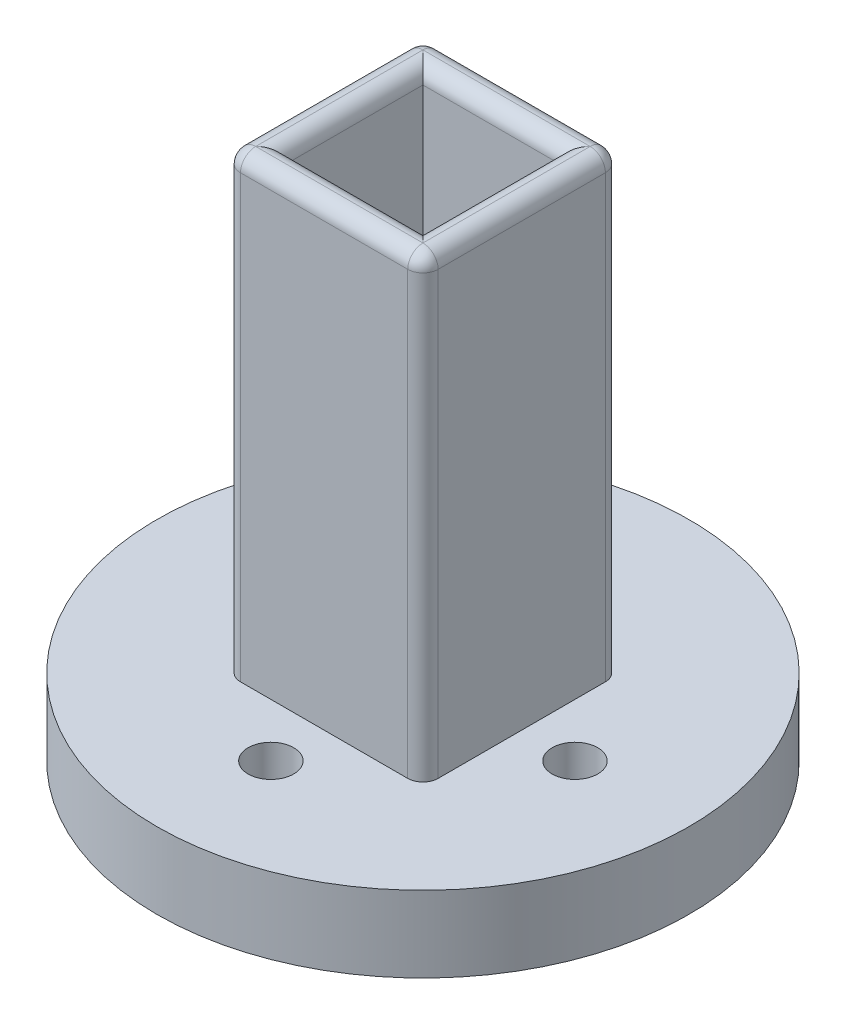
ISO-10303-21;
HEADER;
FILE_DESCRIPTION(('STEP AP214'),'2;1');
FILE_NAME('part.step','',(''),(''),'','','');
FILE_SCHEMA(('AUTOMOTIVE_DESIGN { 1 0 10303 214 1 1 1 1 }'));
ENDSEC;
DATA;
#1=APPLICATION_CONTEXT('core data for automotive mechanical design processes');
#2=APPLICATION_PROTOCOL_DEFINITION('international standard','automotive_design',2000,#1);
#3=PRODUCT_CONTEXT('',#1,'mechanical');
#4=PRODUCT('Part','Part','',(#3));
#5=PRODUCT_RELATED_PRODUCT_CATEGORY('part','',(#4));
#6=PRODUCT_DEFINITION_FORMATION('','',#4);
#7=PRODUCT_DEFINITION_CONTEXT('part definition',#1,'design');
#8=PRODUCT_DEFINITION('design','',#6,#7);
#9=PRODUCT_DEFINITION_SHAPE('','',#8);
#10=(LENGTH_UNIT() NAMED_UNIT(*) SI_UNIT(.MILLI.,.METRE.));
#11=(NAMED_UNIT(*) PLANE_ANGLE_UNIT() SI_UNIT($,.RADIAN.));
#12=(NAMED_UNIT(*) SI_UNIT($,.STERADIAN.) SOLID_ANGLE_UNIT());
#13=UNCERTAINTY_MEASURE_WITH_UNIT(LENGTH_MEASURE(1.E-05),#10,'distance_accuracy_value','');
#14=(GEOMETRIC_REPRESENTATION_CONTEXT(3) GLOBAL_UNCERTAINTY_ASSIGNED_CONTEXT((#13)) GLOBAL_UNIT_ASSIGNED_CONTEXT((#10,
#11,#12)) REPRESENTATION_CONTEXT('',''));
#15=CARTESIAN_POINT('',(0.,0.,0.));
#16=DIRECTION('',(0.,0.,1.));
#17=DIRECTION('',(1.,0.,0.));
#18=AXIS2_PLACEMENT_3D('',#15,#16,#17);
#19=CARTESIAN_POINT('',(0.,5.,0.));
#20=DIRECTION('',(0.,1.,0.));
#21=DIRECTION('',(0.,0.,1.));
#22=AXIS2_PLACEMENT_3D('',#19,#20,#21);
#23=PLANE('',#22);
#24=CARTESIAN_POINT('',(0.,5.,10.));
#25=DIRECTION('',(0.,1.,0.));
#26=DIRECTION('',(0.,0.,1.));
#27=AXIS2_PLACEMENT_3D('',#24,#25,#26);
#28=CIRCLE('',#27,1.5);
#29=CARTESIAN_POINT('',(0.,5.,11.5));
#30=VERTEX_POINT('',#29);
#31=EDGE_CURVE('E262',#30,#30,#28,.T.);
#32=ORIENTED_EDGE('',*,*,#31,.F.);
#33=EDGE_LOOP('',(#32));
#34=FACE_BOUND('',#33,.T.);
#35=CARTESIAN_POINT('',(0.,5.,-10.));
#36=DIRECTION('',(0.,1.,0.));
#37=DIRECTION('',(0.,0.,1.));
#38=AXIS2_PLACEMENT_3D('',#35,#36,#37);
#39=CIRCLE('',#38,1.5);
#40=CARTESIAN_POINT('',(0.,5.,-8.5));
#41=VERTEX_POINT('',#40);
#42=EDGE_CURVE('E274',#41,#41,#39,.T.);
#43=ORIENTED_EDGE('',*,*,#42,.F.);
#44=EDGE_LOOP('',(#43));
#45=FACE_BOUND('',#44,.T.);
#46=CARTESIAN_POINT('',(0.,5.,0.));
#47=DIRECTION('',(0.,1.,0.));
#48=DIRECTION('',(0.,0.,1.));
#49=AXIS2_PLACEMENT_3D('',#46,#47,#48);
#50=CIRCLE('',#49,17.5);
#51=CARTESIAN_POINT('',(0.,5.,17.5));
#52=VERTEX_POINT('',#51);
#53=EDGE_CURVE('E286',#52,#52,#50,.T.);
#54=ORIENTED_EDGE('',*,*,#53,.T.);
#55=EDGE_LOOP('',(#54));
#56=FACE_BOUND('',#55,.T.);
#57=CARTESIAN_POINT('',(10.,5.,0.));
#58=DIRECTION('',(0.,1.,0.));
#59=DIRECTION('',(0.,0.,1.));
#60=AXIS2_PLACEMENT_3D('',#57,#58,#59);
#61=CIRCLE('',#60,1.5);
#62=CARTESIAN_POINT('',(10.,5.,1.5));
#63=VERTEX_POINT('',#62);
#64=EDGE_CURVE('E268',#63,#63,#61,.T.);
#65=ORIENTED_EDGE('',*,*,#64,.F.);
#66=EDGE_LOOP('',(#65));
#67=FACE_BOUND('',#66,.T.);
#68=CARTESIAN_POINT('',(-10.,5.,0.));
#69=DIRECTION('',(0.,1.,0.));
#70=DIRECTION('',(0.,0.,1.));
#71=AXIS2_PLACEMENT_3D('',#68,#69,#70);
#72=CIRCLE('',#71,1.5);
#73=CARTESIAN_POINT('',(-10.,5.,1.5));
#74=VERTEX_POINT('',#73);
#75=EDGE_CURVE('E256',#74,#74,#72,.T.);
#76=ORIENTED_EDGE('',*,*,#75,.F.);
#77=EDGE_LOOP('',(#76));
#78=FACE_BOUND('',#77,.T.);
#79=DIRECTION('',(0.,0.,1.));
#80=VECTOR('',#79,1.);
#81=CARTESIAN_POINT('',(-6.5,5.,-6.5));
#82=LINE('',#81,#80);
#83=CARTESIAN_POINT('',(-6.5,5.,-5.5));
#84=VERTEX_POINT('',#83);
#85=CARTESIAN_POINT('',(-6.5,5.,5.5));
#86=VERTEX_POINT('',#85);
#87=EDGE_CURVE('E158',#84,#86,#82,.T.);
#88=ORIENTED_EDGE('',*,*,#87,.F.);
#89=CARTESIAN_POINT('',(-5.5,5.,-5.5));
#90=DIRECTION('',(0.,1.,0.));
#91=DIRECTION('',(0.,0.,1.));
#92=AXIS2_PLACEMENT_3D('',#89,#90,#91);
#93=CIRCLE('',#92,1.);
#94=CARTESIAN_POINT('',(-5.5,5.,-6.5));
#95=VERTEX_POINT('',#94);
#96=EDGE_CURVE('E154',#84,#95,#93,.F.);
#97=ORIENTED_EDGE('',*,*,#96,.T.);
#98=DIRECTION('',(-1.,0.,0.));
#99=VECTOR('',#98,1.);
#100=CARTESIAN_POINT('',(6.5,5.,-6.49999999999995));
#101=LINE('',#100,#99);
#102=CARTESIAN_POINT('',(5.5,5.,-6.49999999999996));
#103=VERTEX_POINT('',#102);
#104=EDGE_CURVE('E155',#103,#95,#101,.T.);
#105=ORIENTED_EDGE('',*,*,#104,.F.);
#106=CARTESIAN_POINT('',(5.5,5.,-5.49999999999996));
#107=DIRECTION('',(0.,1.,0.));
#108=DIRECTION('',(0.,0.,1.));
#109=AXIS2_PLACEMENT_3D('',#106,#107,#108);
#110=CIRCLE('',#109,1.);
#111=CARTESIAN_POINT('',(6.5,5.,-5.49999999999996));
#112=VERTEX_POINT('',#111);
#113=EDGE_CURVE('E161',#103,#112,#110,.F.);
#114=ORIENTED_EDGE('',*,*,#113,.T.);
#115=DIRECTION('',(0.,0.,-1.));
#116=VECTOR('',#115,1.);
#117=CARTESIAN_POINT('',(6.5,5.,6.5));
#118=LINE('',#117,#116);
#119=CARTESIAN_POINT('',(6.5,5.,5.5));
#120=VERTEX_POINT('',#119);
#121=EDGE_CURVE('E252',#120,#112,#118,.T.);
#122=ORIENTED_EDGE('',*,*,#121,.F.);
#123=CARTESIAN_POINT('',(5.5,5.,5.5));
#124=DIRECTION('',(0.,1.,0.));
#125=DIRECTION('',(0.,0.,1.));
#126=AXIS2_PLACEMENT_3D('',#123,#124,#125);
#127=CIRCLE('',#126,1.);
#128=CARTESIAN_POINT('',(5.5,5.,6.5));
#129=VERTEX_POINT('',#128);
#130=EDGE_CURVE('E48',#120,#129,#127,.F.);
#131=ORIENTED_EDGE('',*,*,#130,.T.);
#132=DIRECTION('',(1.,0.,0.));
#133=VECTOR('',#132,1.);
#134=CARTESIAN_POINT('',(-6.5,5.,6.5));
#135=LINE('',#134,#133);
#136=CARTESIAN_POINT('',(-5.5,5.,6.5));
#137=VERTEX_POINT('',#136);
#138=EDGE_CURVE('E249',#137,#129,#135,.T.);
#139=ORIENTED_EDGE('',*,*,#138,.F.);
#140=CARTESIAN_POINT('',(-5.5,5.,5.5));
#141=DIRECTION('',(0.,1.,0.));
#142=DIRECTION('',(0.,0.,1.));
#143=AXIS2_PLACEMENT_3D('',#140,#141,#142);
#144=CIRCLE('',#143,1.);
#145=EDGE_CURVE('E11',#137,#86,#144,.F.);
#146=ORIENTED_EDGE('',*,*,#145,.T.);
#147=EDGE_LOOP('',(#88,#97,#105,#114,#122,#131,#139,#146));
#148=FACE_BOUND('',#147,.T.);
#149=ADVANCED_FACE('F38',(#34,#45,#56,#67,#78,#148),#23,.T.);
#150=DIRECTION('',(0.,0.,1.));
#151=VECTOR('',#150,1.);
#152=CARTESIAN_POINT('',(-4.49999999999959,5.,4.49999999999997));
#153=LINE('',#152,#151);
#154=CARTESIAN_POINT('',(-4.49999999999962,5.,-4.50000000000003));
#155=VERTEX_POINT('',#154);
#156=CARTESIAN_POINT('',(-4.49999999999959,5.,4.49999999999997));
#157=VERTEX_POINT('',#156);
#158=EDGE_CURVE('E225',#155,#157,#153,.T.);
#159=ORIENTED_EDGE('',*,*,#158,.T.);
#160=DIRECTION('',(1.,0.,0.));
#161=VECTOR('',#160,1.);
#162=CARTESIAN_POINT('',(4.50000000000038,5.,4.49999999999996));
#163=LINE('',#162,#161);
#164=CARTESIAN_POINT('',(4.50000000000038,5.,4.49999999999996));
#165=VERTEX_POINT('',#164);
#166=EDGE_CURVE('E229',#157,#165,#163,.T.);
#167=ORIENTED_EDGE('',*,*,#166,.T.);
#168=DIRECTION('',(0.,0.,-1.));
#169=VECTOR('',#168,1.);
#170=CARTESIAN_POINT('',(4.50000000000038,5.,-4.50000000000003));
#171=LINE('',#170,#169);
#172=CARTESIAN_POINT('',(4.50000000000038,5.,-4.50000000000003));
#173=VERTEX_POINT('',#172);
#174=EDGE_CURVE('E236',#165,#173,#171,.T.);
#175=ORIENTED_EDGE('',*,*,#174,.T.);
#176=DIRECTION('',(-1.,0.,0.));
#177=VECTOR('',#176,1.);
#178=CARTESIAN_POINT('',(-4.49999999999962,5.,-4.50000000000003));
#179=LINE('',#178,#177);
#180=EDGE_CURVE('E240',#173,#155,#179,.T.);
#181=ORIENTED_EDGE('',*,*,#180,.T.);
#182=EDGE_LOOP('',(#159,#167,#175,#181));
#183=FACE_BOUND('',#182,.T.);
#184=CARTESIAN_POINT('',(0.,5.,0.));
#185=DIRECTION('',(0.,1.,0.));
#186=DIRECTION('',(0.,0.,1.));
#187=AXIS2_PLACEMENT_3D('',#184,#185,#186);
#188=CIRCLE('',#187,4.05);
#189=CARTESIAN_POINT('',(0.,5.,4.05));
#190=VERTEX_POINT('',#189);
#191=EDGE_CURVE('E280',#190,#190,#188,.T.);
#192=ORIENTED_EDGE('',*,*,#191,.F.);
#193=EDGE_LOOP('',(#192));
#194=FACE_BOUND('',#193,.T.);
#195=ADVANCED_FACE('F378',(#183,#194),#23,.T.);
#196=CARTESIAN_POINT('',(0.,0.,0.));
#197=DIRECTION('',(0.,1.,0.));
#198=DIRECTION('',(0.,0.,1.));
#199=AXIS2_PLACEMENT_3D('',#196,#197,#198);
#200=PLANE('',#199);
#201=CARTESIAN_POINT('',(0.,0.,0.));
#202=DIRECTION('',(0.,1.,0.));
#203=DIRECTION('',(0.,0.,1.));
#204=AXIS2_PLACEMENT_3D('',#201,#202,#203);
#205=CIRCLE('',#204,17.5);
#206=CARTESIAN_POINT('',(0.,0.,17.5));
#207=VERTEX_POINT('',#206);
#208=EDGE_CURVE('E283',#207,#207,#205,.T.);
#209=ORIENTED_EDGE('',*,*,#208,.F.);
#210=EDGE_LOOP('',(#209));
#211=FACE_BOUND('',#210,.T.);
#212=CARTESIAN_POINT('',(0.,0.,0.));
#213=DIRECTION('',(0.,1.,0.));
#214=DIRECTION('',(0.,0.,1.));
#215=AXIS2_PLACEMENT_3D('',#212,#213,#214);
#216=CIRCLE('',#215,4.05);
#217=CARTESIAN_POINT('',(0.,0.,4.05));
#218=VERTEX_POINT('',#217);
#219=EDGE_CURVE('E277',#218,#218,#216,.T.);
#220=ORIENTED_EDGE('',*,*,#219,.T.);
#221=EDGE_LOOP('',(#220));
#222=FACE_BOUND('',#221,.T.);
#223=CARTESIAN_POINT('',(0.,0.,-10.));
#224=DIRECTION('',(0.,1.,0.));
#225=DIRECTION('',(0.,0.,1.));
#226=AXIS2_PLACEMENT_3D('',#223,#224,#225);
#227=CIRCLE('',#226,1.5);
#228=CARTESIAN_POINT('',(0.,0.,-8.5));
#229=VERTEX_POINT('',#228);
#230=EDGE_CURVE('E271',#229,#229,#227,.T.);
#231=ORIENTED_EDGE('',*,*,#230,.T.);
#232=EDGE_LOOP('',(#231));
#233=FACE_BOUND('',#232,.T.);
#234=CARTESIAN_POINT('',(10.,0.,0.));
#235=DIRECTION('',(0.,1.,0.));
#236=DIRECTION('',(0.,0.,1.));
#237=AXIS2_PLACEMENT_3D('',#234,#235,#236);
#238=CIRCLE('',#237,1.5);
#239=CARTESIAN_POINT('',(10.,0.,1.5));
#240=VERTEX_POINT('',#239);
#241=EDGE_CURVE('E265',#240,#240,#238,.T.);
#242=ORIENTED_EDGE('',*,*,#241,.T.);
#243=EDGE_LOOP('',(#242));
#244=FACE_BOUND('',#243,.T.);
#245=CARTESIAN_POINT('',(0.,0.,10.));
#246=DIRECTION('',(0.,1.,0.));
#247=DIRECTION('',(0.,0.,1.));
#248=AXIS2_PLACEMENT_3D('',#245,#246,#247);
#249=CIRCLE('',#248,1.5);
#250=CARTESIAN_POINT('',(0.,0.,11.5));
#251=VERTEX_POINT('',#250);
#252=EDGE_CURVE('E259',#251,#251,#249,.T.);
#253=ORIENTED_EDGE('',*,*,#252,.T.);
#254=EDGE_LOOP('',(#253));
#255=FACE_BOUND('',#254,.T.);
#256=CARTESIAN_POINT('',(-10.,0.,0.));
#257=DIRECTION('',(0.,1.,0.));
#258=DIRECTION('',(0.,0.,1.));
#259=AXIS2_PLACEMENT_3D('',#256,#257,#258);
#260=CIRCLE('',#259,1.5);
#261=CARTESIAN_POINT('',(-10.,0.,1.5));
#262=VERTEX_POINT('',#261);
#263=EDGE_CURVE('E255',#262,#262,#260,.T.);
#264=ORIENTED_EDGE('',*,*,#263,.T.);
#265=EDGE_LOOP('',(#264));
#266=FACE_BOUND('',#265,.T.);
#267=ADVANCED_FACE('F399',(#211,#222,#233,#244,#255,#266),#200,.F.);
#268=CARTESIAN_POINT('',(0.,5.,0.));
#269=DIRECTION('',(0.,-1.,0.));
#270=DIRECTION('',(0.,0.,-1.));
#271=AXIS2_PLACEMENT_3D('',#268,#269,#270);
#272=CYLINDRICAL_SURFACE('',#271,17.5);
#273=ORIENTED_EDGE('',*,*,#53,.F.);
#274=EDGE_LOOP('',(#273));
#275=FACE_BOUND('',#274,.T.);
#276=ORIENTED_EDGE('',*,*,#208,.T.);
#277=EDGE_LOOP('',(#276));
#278=FACE_BOUND('',#277,.T.);
#279=ADVANCED_FACE('F408',(#275,#278),#272,.T.);
#280=CARTESIAN_POINT('',(0.,5.,0.));
#281=DIRECTION('',(0.,-1.,0.));
#282=DIRECTION('',(0.,0.,-1.));
#283=AXIS2_PLACEMENT_3D('',#280,#281,#282);
#284=CYLINDRICAL_SURFACE('',#283,4.05);
#285=ORIENTED_EDGE('',*,*,#191,.T.);
#286=EDGE_LOOP('',(#285));
#287=FACE_BOUND('',#286,.T.);
#288=ORIENTED_EDGE('',*,*,#219,.F.);
#289=EDGE_LOOP('',(#288));
#290=FACE_BOUND('',#289,.T.);
#291=ADVANCED_FACE('F404',(#287,#290),#284,.F.);
#292=CARTESIAN_POINT('',(0.,5.,-10.));
#293=DIRECTION('',(0.,-1.,0.));
#294=DIRECTION('',(0.,0.,-1.));
#295=AXIS2_PLACEMENT_3D('',#292,#293,#294);
#296=CYLINDRICAL_SURFACE('',#295,1.5);
#297=ORIENTED_EDGE('',*,*,#42,.T.);
#298=EDGE_LOOP('',(#297));
#299=FACE_BOUND('',#298,.T.);
#300=ORIENTED_EDGE('',*,*,#230,.F.);
#301=EDGE_LOOP('',(#300));
#302=FACE_BOUND('',#301,.T.);
#303=ADVANCED_FACE('F541',(#299,#302),#296,.F.);
#304=CARTESIAN_POINT('',(10.,5.,0.));
#305=DIRECTION('',(0.,-1.,0.));
#306=DIRECTION('',(0.,0.,-1.));
#307=AXIS2_PLACEMENT_3D('',#304,#305,#306);
#308=CYLINDRICAL_SURFACE('',#307,1.5);
#309=ORIENTED_EDGE('',*,*,#64,.T.);
#310=EDGE_LOOP('',(#309));
#311=FACE_BOUND('',#310,.T.);
#312=ORIENTED_EDGE('',*,*,#241,.F.);
#313=EDGE_LOOP('',(#312));
#314=FACE_BOUND('',#313,.T.);
#315=ADVANCED_FACE('F531',(#311,#314),#308,.F.);
#316=CARTESIAN_POINT('',(0.,5.,10.));
#317=DIRECTION('',(0.,-1.,0.));
#318=DIRECTION('',(0.,0.,-1.));
#319=AXIS2_PLACEMENT_3D('',#316,#317,#318);
#320=CYLINDRICAL_SURFACE('',#319,1.5);
#321=ORIENTED_EDGE('',*,*,#31,.T.);
#322=EDGE_LOOP('',(#321));
#323=FACE_BOUND('',#322,.T.);
#324=ORIENTED_EDGE('',*,*,#252,.F.);
#325=EDGE_LOOP('',(#324));
#326=FACE_BOUND('',#325,.T.);
#327=ADVANCED_FACE('F521',(#323,#326),#320,.F.);
#328=CARTESIAN_POINT('',(-10.,5.,0.));
#329=DIRECTION('',(0.,-1.,0.));
#330=DIRECTION('',(0.,0.,-1.));
#331=AXIS2_PLACEMENT_3D('',#328,#329,#330);
#332=CYLINDRICAL_SURFACE('',#331,1.5);
#333=ORIENTED_EDGE('',*,*,#75,.T.);
#334=EDGE_LOOP('',(#333));
#335=FACE_BOUND('',#334,.T.);
#336=ORIENTED_EDGE('',*,*,#263,.F.);
#337=EDGE_LOOP('',(#336));
#338=FACE_BOUND('',#337,.T.);
#339=ADVANCED_FACE('F500',(#335,#338),#332,.F.);
#340=CARTESIAN_POINT('',(6.5,35.,-6.49999999999995));
#341=DIRECTION('',(0.,0.,1.));
#342=DIRECTION('',(1.,0.,0.));
#343=AXIS2_PLACEMENT_3D('',#340,#341,#342);
#344=PLANE('',#343);
#345=ORIENTED_EDGE('',*,*,#104,.T.);
#346=DIRECTION('',(0.,-1.,0.));
#347=VECTOR('',#346,1.);
#348=CARTESIAN_POINT('',(-5.5,35.,-6.5));
#349=LINE('',#348,#347);
#350=CARTESIAN_POINT('',(-5.5,34.,-6.5));
#351=VERTEX_POINT('',#350);
#352=EDGE_CURVE('E57',#95,#351,#349,.F.);
#353=ORIENTED_EDGE('',*,*,#352,.T.);
#354=DIRECTION('',(-1.,0.,0.));
#355=VECTOR('',#354,1.);
#356=CARTESIAN_POINT('',(6.5,34.,-6.49999999999995));
#357=LINE('',#356,#355);
#358=CARTESIAN_POINT('',(5.5,34.,-6.49999999999996));
#359=VERTEX_POINT('',#358);
#360=EDGE_CURVE('E170',#351,#359,#357,.F.);
#361=ORIENTED_EDGE('',*,*,#360,.T.);
#362=DIRECTION('',(0.,-1.,0.));
#363=VECTOR('',#362,1.);
#364=CARTESIAN_POINT('',(5.5,35.,-6.49999999999996));
#365=LINE('',#364,#363);
#366=EDGE_CURVE('E165',#359,#103,#365,.T.);
#367=ORIENTED_EDGE('',*,*,#366,.T.);
#368=EDGE_LOOP('',(#345,#353,#361,#367));
#369=FACE_BOUND('',#368,.T.);
#370=ADVANCED_FACE('F163',(#369),#344,.F.);
#371=CARTESIAN_POINT('',(-6.5,35.,-6.5));
#372=DIRECTION('',(1.,0.,0.));
#373=DIRECTION('',(0.,0.,-1.));
#374=AXIS2_PLACEMENT_3D('',#371,#372,#373);
#375=PLANE('',#374);
#376=DIRECTION('',(0.,0.,1.));
#377=VECTOR('',#376,1.);
#378=CARTESIAN_POINT('',(-6.5,34.,-6.5));
#379=LINE('',#378,#377);
#380=CARTESIAN_POINT('',(-6.5,34.,5.5));
#381=VERTEX_POINT('',#380);
#382=CARTESIAN_POINT('',(-6.5,34.,-5.5));
#383=VERTEX_POINT('',#382);
#384=EDGE_CURVE('E301',#381,#383,#379,.F.);
#385=ORIENTED_EDGE('',*,*,#384,.T.);
#386=DIRECTION('',(0.,-1.,0.));
#387=VECTOR('',#386,1.);
#388=CARTESIAN_POINT('',(-6.5,35.,-5.5));
#389=LINE('',#388,#387);
#390=EDGE_CURVE('E304',#383,#84,#389,.T.);
#391=ORIENTED_EDGE('',*,*,#390,.T.);
#392=ORIENTED_EDGE('',*,*,#87,.T.);
#393=DIRECTION('',(0.,-1.,0.));
#394=VECTOR('',#393,1.);
#395=CARTESIAN_POINT('',(-6.5,35.,5.5));
#396=LINE('',#395,#394);
#397=EDGE_CURVE('E299',#86,#381,#396,.F.);
#398=ORIENTED_EDGE('',*,*,#397,.T.);
#399=EDGE_LOOP('',(#385,#391,#392,#398));
#400=FACE_BOUND('',#399,.T.);
#401=ADVANCED_FACE('F357',(#400),#375,.F.);
#402=CARTESIAN_POINT('',(-6.5,35.,6.5));
#403=DIRECTION('',(0.,0.,-1.));
#404=DIRECTION('',(-1.,0.,0.));
#405=AXIS2_PLACEMENT_3D('',#402,#403,#404);
#406=PLANE('',#405);
#407=ORIENTED_EDGE('',*,*,#138,.T.);
#408=DIRECTION('',(0.,-1.,0.));
#409=VECTOR('',#408,1.);
#410=CARTESIAN_POINT('',(5.5,35.,6.5));
#411=LINE('',#410,#409);
#412=CARTESIAN_POINT('',(5.5,34.,6.5));
#413=VERTEX_POINT('',#412);
#414=EDGE_CURVE('E310',#129,#413,#411,.F.);
#415=ORIENTED_EDGE('',*,*,#414,.T.);
#416=DIRECTION('',(1.,0.,0.));
#417=VECTOR('',#416,1.);
#418=CARTESIAN_POINT('',(-6.5,34.,6.5));
#419=LINE('',#418,#417);
#420=CARTESIAN_POINT('',(-5.5,34.,6.5));
#421=VERTEX_POINT('',#420);
#422=EDGE_CURVE('E308',#413,#421,#419,.F.);
#423=ORIENTED_EDGE('',*,*,#422,.T.);
#424=DIRECTION('',(0.,-1.,0.));
#425=VECTOR('',#424,1.);
#426=CARTESIAN_POINT('',(-5.5,35.,6.5));
#427=LINE('',#426,#425);
#428=EDGE_CURVE('E306',#421,#137,#427,.T.);
#429=ORIENTED_EDGE('',*,*,#428,.T.);
#430=EDGE_LOOP('',(#407,#415,#423,#429));
#431=FACE_BOUND('',#430,.T.);
#432=ADVANCED_FACE('F350',(#431),#406,.F.);
#433=CARTESIAN_POINT('',(6.5,35.,6.5));
#434=DIRECTION('',(-1.,0.,0.));
#435=DIRECTION('',(0.,0.,1.));
#436=AXIS2_PLACEMENT_3D('',#433,#434,#435);
#437=PLANE('',#436);
#438=ORIENTED_EDGE('',*,*,#121,.T.);
#439=DIRECTION('',(0.,-1.,0.));
#440=VECTOR('',#439,1.);
#441=CARTESIAN_POINT('',(6.5,35.,-5.49999999999996));
#442=LINE('',#441,#440);
#443=CARTESIAN_POINT('',(6.5,34.,-5.49999999999996));
#444=VERTEX_POINT('',#443);
#445=EDGE_CURVE('E316',#112,#444,#442,.F.);
#446=ORIENTED_EDGE('',*,*,#445,.T.);
#447=DIRECTION('',(0.,0.,-1.));
#448=VECTOR('',#447,1.);
#449=CARTESIAN_POINT('',(6.5,34.,6.5));
#450=LINE('',#449,#448);
#451=CARTESIAN_POINT('',(6.5,34.,5.5));
#452=VERTEX_POINT('',#451);
#453=EDGE_CURVE('E314',#444,#452,#450,.F.);
#454=ORIENTED_EDGE('',*,*,#453,.T.);
#455=DIRECTION('',(0.,-1.,0.));
#456=VECTOR('',#455,1.);
#457=CARTESIAN_POINT('',(6.5,35.,5.5));
#458=LINE('',#457,#456);
#459=EDGE_CURVE('E312',#452,#120,#458,.T.);
#460=ORIENTED_EDGE('',*,*,#459,.T.);
#461=EDGE_LOOP('',(#438,#446,#454,#460));
#462=FACE_BOUND('',#461,.T.);
#463=ADVANCED_FACE('F320',(#462),#437,.F.);
#464=CARTESIAN_POINT('',(-4.49999999999959,35.,4.49999999999997));
#465=DIRECTION('',(1.,0.,0.));
#466=DIRECTION('',(0.,0.,-1.));
#467=AXIS2_PLACEMENT_3D('',#464,#465,#466);
#468=PLANE('',#467);
#469=DIRECTION('',(0.,-1.,0.));
#470=VECTOR('',#469,1.);
#471=CARTESIAN_POINT('',(-4.49999999999962,35.,-4.50000000000003));
#472=LINE('',#471,#470);
#473=CARTESIAN_POINT('',(-4.49999999999962,34.,-4.50000000000003));
#474=VERTEX_POINT('',#473);
#475=EDGE_CURVE('E242',#474,#155,#472,.T.);
#476=ORIENTED_EDGE('',*,*,#475,.F.);
#477=DIRECTION('',(0.,0.,1.));
#478=VECTOR('',#477,1.);
#479=CARTESIAN_POINT('',(-4.49999999999959,34.,4.49999999999997));
#480=LINE('',#479,#478);
#481=CARTESIAN_POINT('',(-4.49999999999959,34.,4.49999999999997));
#482=VERTEX_POINT('',#481);
#483=EDGE_CURVE('E297',#474,#482,#480,.T.);
#484=ORIENTED_EDGE('',*,*,#483,.T.);
#485=DIRECTION('',(0.,-1.,0.));
#486=VECTOR('',#485,1.);
#487=CARTESIAN_POINT('',(-4.49999999999959,35.,4.49999999999997));
#488=LINE('',#487,#486);
#489=EDGE_CURVE('E166',#482,#157,#488,.T.);
#490=ORIENTED_EDGE('',*,*,#489,.T.);
#491=ORIENTED_EDGE('',*,*,#158,.F.);
#492=EDGE_LOOP('',(#476,#484,#490,#491));
#493=FACE_BOUND('',#492,.T.);
#494=ADVANCED_FACE('F381',(#493),#468,.T.);
#495=CARTESIAN_POINT('',(4.50000000000038,35.,4.49999999999996));
#496=DIRECTION('',(0.,0.,-1.));
#497=DIRECTION('',(-1.,0.,0.));
#498=AXIS2_PLACEMENT_3D('',#495,#496,#497);
#499=PLANE('',#498);
#500=ORIENTED_EDGE('',*,*,#489,.F.);
#501=DIRECTION('',(1.,0.,0.));
#502=VECTOR('',#501,1.);
#503=CARTESIAN_POINT('',(4.50000000000038,34.,4.49999999999996));
#504=LINE('',#503,#502);
#505=CARTESIAN_POINT('',(4.50000000000038,34.,4.49999999999996));
#506=VERTEX_POINT('',#505);
#507=EDGE_CURVE('E295',#482,#506,#504,.T.);
#508=ORIENTED_EDGE('',*,*,#507,.T.);
#509=DIRECTION('',(0.,-1.,0.));
#510=VECTOR('',#509,1.);
#511=CARTESIAN_POINT('',(4.50000000000038,35.,4.49999999999996));
#512=LINE('',#511,#510);
#513=EDGE_CURVE('E245',#506,#165,#512,.T.);
#514=ORIENTED_EDGE('',*,*,#513,.T.);
#515=ORIENTED_EDGE('',*,*,#166,.F.);
#516=EDGE_LOOP('',(#500,#508,#514,#515));
#517=FACE_BOUND('',#516,.T.);
#518=ADVANCED_FACE('F384',(#517),#499,.T.);
#519=CARTESIAN_POINT('',(4.50000000000038,35.,-4.50000000000003));
#520=DIRECTION('',(-1.,0.,0.));
#521=DIRECTION('',(0.,0.,1.));
#522=AXIS2_PLACEMENT_3D('',#519,#520,#521);
#523=PLANE('',#522);
#524=ORIENTED_EDGE('',*,*,#513,.F.);
#525=DIRECTION('',(0.,0.,-1.));
#526=VECTOR('',#525,1.);
#527=CARTESIAN_POINT('',(4.50000000000038,34.,-4.50000000000003));
#528=LINE('',#527,#526);
#529=CARTESIAN_POINT('',(4.50000000000038,34.,-4.50000000000003));
#530=VERTEX_POINT('',#529);
#531=EDGE_CURVE('E289',#506,#530,#528,.T.);
#532=ORIENTED_EDGE('',*,*,#531,.T.);
#533=DIRECTION('',(0.,-1.,0.));
#534=VECTOR('',#533,1.);
#535=CARTESIAN_POINT('',(4.50000000000038,35.,-4.50000000000003));
#536=LINE('',#535,#534);
#537=EDGE_CURVE('E90',#530,#173,#536,.T.);
#538=ORIENTED_EDGE('',*,*,#537,.T.);
#539=ORIENTED_EDGE('',*,*,#174,.F.);
#540=EDGE_LOOP('',(#524,#532,#538,#539));
#541=FACE_BOUND('',#540,.T.);
#542=ADVANCED_FACE('F373',(#541),#523,.T.);
#543=CARTESIAN_POINT('',(-4.49999999999962,35.,-4.50000000000003));
#544=DIRECTION('',(0.,0.,1.));
#545=DIRECTION('',(1.,0.,0.));
#546=AXIS2_PLACEMENT_3D('',#543,#544,#545);
#547=PLANE('',#546);
#548=ORIENTED_EDGE('',*,*,#537,.F.);
#549=DIRECTION('',(-1.,0.,0.));
#550=VECTOR('',#549,1.);
#551=CARTESIAN_POINT('',(-4.49999999999962,34.,-4.50000000000003));
#552=LINE('',#551,#550);
#553=EDGE_CURVE('E293',#530,#474,#552,.T.);
#554=ORIENTED_EDGE('',*,*,#553,.T.);
#555=ORIENTED_EDGE('',*,*,#475,.T.);
#556=ORIENTED_EDGE('',*,*,#180,.F.);
#557=EDGE_LOOP('',(#548,#554,#555,#556));
#558=FACE_BOUND('',#557,.T.);
#559=ADVANCED_FACE('F376',(#558),#547,.T.);
#560=CARTESIAN_POINT('',(-5.5,35.,5.5));
#561=DIRECTION('',(0.,-1.,0.));
#562=DIRECTION('',(0.,0.,-1.));
#563=AXIS2_PLACEMENT_3D('',#560,#561,#562);
#564=CYLINDRICAL_SURFACE('',#563,1.);
#565=ORIENTED_EDGE('',*,*,#145,.F.);
#566=ORIENTED_EDGE('',*,*,#428,.F.);
#567=CARTESIAN_POINT('',(-5.5,34.,5.5));
#568=DIRECTION('',(0.,1.,0.));
#569=DIRECTION('',(0.,0.,1.));
#570=AXIS2_PLACEMENT_3D('',#567,#568,#569);
#571=CIRCLE('',#570,1.);
#572=EDGE_CURVE('E42',#381,#421,#571,.T.);
#573=ORIENTED_EDGE('',*,*,#572,.F.);
#574=ORIENTED_EDGE('',*,*,#397,.F.);
#575=EDGE_LOOP('',(#565,#566,#573,#574));
#576=FACE_BOUND('',#575,.T.);
#577=ADVANCED_FACE('F40',(#576),#564,.T.);
#578=CARTESIAN_POINT('',(-5.5,35.,-5.5));
#579=DIRECTION('',(0.,-1.,0.));
#580=DIRECTION('',(0.,0.,-1.));
#581=AXIS2_PLACEMENT_3D('',#578,#579,#580);
#582=CYLINDRICAL_SURFACE('',#581,1.);
#583=ORIENTED_EDGE('',*,*,#96,.F.);
#584=ORIENTED_EDGE('',*,*,#390,.F.);
#585=CARTESIAN_POINT('',(-5.5,34.,-5.5));
#586=DIRECTION('',(0.,1.,0.));
#587=DIRECTION('',(0.,0.,1.));
#588=AXIS2_PLACEMENT_3D('',#585,#586,#587);
#589=CIRCLE('',#588,1.);
#590=EDGE_CURVE('E169',#351,#383,#589,.T.);
#591=ORIENTED_EDGE('',*,*,#590,.F.);
#592=ORIENTED_EDGE('',*,*,#352,.F.);
#593=EDGE_LOOP('',(#583,#584,#591,#592));
#594=FACE_BOUND('',#593,.T.);
#595=ADVANCED_FACE('F168',(#594),#582,.T.);
#596=CARTESIAN_POINT('',(5.5,35.,-5.49999999999996));
#597=DIRECTION('',(0.,-1.,0.));
#598=DIRECTION('',(0.,0.,-1.));
#599=AXIS2_PLACEMENT_3D('',#596,#597,#598);
#600=CYLINDRICAL_SURFACE('',#599,1.);
#601=ORIENTED_EDGE('',*,*,#113,.F.);
#602=ORIENTED_EDGE('',*,*,#366,.F.);
#603=CARTESIAN_POINT('',(5.5,34.,-5.49999999999996));
#604=DIRECTION('',(0.,1.,0.));
#605=DIRECTION('',(0.,0.,1.));
#606=AXIS2_PLACEMENT_3D('',#603,#604,#605);
#607=CIRCLE('',#606,1.);
#608=EDGE_CURVE('E220',#444,#359,#607,.T.);
#609=ORIENTED_EDGE('',*,*,#608,.F.);
#610=ORIENTED_EDGE('',*,*,#445,.F.);
#611=EDGE_LOOP('',(#601,#602,#609,#610));
#612=FACE_BOUND('',#611,.T.);
#613=ADVANCED_FACE('F326',(#612),#600,.T.);
#614=CARTESIAN_POINT('',(5.5,35.,5.5));
#615=DIRECTION('',(0.,-1.,0.));
#616=DIRECTION('',(0.,0.,-1.));
#617=AXIS2_PLACEMENT_3D('',#614,#615,#616);
#618=CYLINDRICAL_SURFACE('',#617,1.);
#619=ORIENTED_EDGE('',*,*,#130,.F.);
#620=ORIENTED_EDGE('',*,*,#459,.F.);
#621=CARTESIAN_POINT('',(5.5,34.,5.5));
#622=DIRECTION('',(0.,1.,0.));
#623=DIRECTION('',(0.,0.,1.));
#624=AXIS2_PLACEMENT_3D('',#621,#622,#623);
#625=CIRCLE('',#624,1.);
#626=EDGE_CURVE('E217',#413,#452,#625,.T.);
#627=ORIENTED_EDGE('',*,*,#626,.F.);
#628=ORIENTED_EDGE('',*,*,#414,.F.);
#629=EDGE_LOOP('',(#619,#620,#627,#628));
#630=FACE_BOUND('',#629,.T.);
#631=ADVANCED_FACE('F439',(#630),#618,.T.);
#632=CARTESIAN_POINT('',(-5.5,34.,5.5));
#633=DIRECTION('',(0.,0.,1.));
#634=DIRECTION('',(1.,0.,0.));
#635=AXIS2_PLACEMENT_3D('',#632,#633,#634);
#636=SPHERICAL_SURFACE('',#635,1.);
#637=CARTESIAN_POINT('',(-5.5,34.,5.5));
#638=DIRECTION('',(0.,0.,1.));
#639=DIRECTION('',(1.,0.,0.));
#640=AXIS2_PLACEMENT_3D('',#637,#638,#639);
#641=CIRCLE('',#640,1.);
#642=CARTESIAN_POINT('',(-5.49999999999958,35.,5.49999999999997));
#643=VERTEX_POINT('',#642);
#644=EDGE_CURVE('E81',#381,#643,#641,.F.);
#645=ORIENTED_EDGE('',*,*,#644,.F.);
#646=ORIENTED_EDGE('',*,*,#572,.T.);
#647=CARTESIAN_POINT('',(-5.5,34.,5.5));
#648=DIRECTION('',(-1.,0.,0.));
#649=DIRECTION('',(0.,-1.,0.));
#650=AXIS2_PLACEMENT_3D('',#647,#648,#649);
#651=CIRCLE('',#650,1.);
#652=EDGE_CURVE('E212',#643,#421,#651,.F.);
#653=ORIENTED_EDGE('',*,*,#652,.F.);
#654=EDGE_LOOP('',(#645,#646,#653));
#655=FACE_BOUND('',#654,.T.);
#656=ADVANCED_FACE('F436',(#655),#636,.T.);
#657=CARTESIAN_POINT('',(-5.5,34.,0.));
#658=DIRECTION('',(0.,0.,-1.));
#659=DIRECTION('',(-1.,0.,0.));
#660=AXIS2_PLACEMENT_3D('',#657,#658,#659);
#661=CYLINDRICAL_SURFACE('',#660,1.);
#662=CARTESIAN_POINT('',(-5.5,34.,-5.5));
#663=DIRECTION('',(0.,0.,-1.));
#664=DIRECTION('',(-1.,0.,0.));
#665=AXIS2_PLACEMENT_3D('',#662,#663,#664);
#666=CIRCLE('',#665,1.);
#667=CARTESIAN_POINT('',(-5.49999999999962,35.,-5.50000000000003));
#668=VERTEX_POINT('',#667);
#669=EDGE_CURVE('E74',#383,#668,#666,.T.);
#670=ORIENTED_EDGE('',*,*,#669,.F.);
#671=ORIENTED_EDGE('',*,*,#384,.F.);
#672=ORIENTED_EDGE('',*,*,#644,.T.);
#673=DIRECTION('',(0.,0.,1.));
#674=VECTOR('',#673,1.);
#675=CARTESIAN_POINT('',(-5.5,35.,6.5));
#676=LINE('',#675,#674);
#677=EDGE_CURVE('E209',#668,#643,#676,.T.);
#678=ORIENTED_EDGE('',*,*,#677,.F.);
#679=EDGE_LOOP('',(#670,#671,#672,#678));
#680=FACE_BOUND('',#679,.T.);
#681=ADVANCED_FACE('F358',(#680),#661,.T.);
#682=CARTESIAN_POINT('',(-5.5,34.,-5.5));
#683=DIRECTION('',(0.,0.,1.));
#684=DIRECTION('',(1.,0.,0.));
#685=AXIS2_PLACEMENT_3D('',#682,#683,#684);
#686=SPHERICAL_SURFACE('',#685,1.);
#687=ORIENTED_EDGE('',*,*,#590,.T.);
#688=ORIENTED_EDGE('',*,*,#669,.T.);
#689=CARTESIAN_POINT('',(-5.5,34.,-5.5));
#690=DIRECTION('',(-1.,0.,0.));
#691=DIRECTION('',(0.,0.,1.));
#692=AXIS2_PLACEMENT_3D('',#689,#690,#691);
#693=CIRCLE('',#692,1.);
#694=EDGE_CURVE('E206',#351,#668,#693,.F.);
#695=ORIENTED_EDGE('',*,*,#694,.F.);
#696=EDGE_LOOP('',(#687,#688,#695));
#697=FACE_BOUND('',#696,.T.);
#698=ADVANCED_FACE('F431',(#697),#686,.T.);
#699=CARTESIAN_POINT('',(5.5,34.,-5.49999999999996));
#700=DIRECTION('',(0.,0.,1.));
#701=DIRECTION('',(1.,0.,0.));
#702=AXIS2_PLACEMENT_3D('',#699,#700,#701);
#703=SPHERICAL_SURFACE('',#702,1.);
#704=CARTESIAN_POINT('',(5.5,34.,-5.49999999999996));
#705=DIRECTION('',(0.,0.,-1.));
#706=DIRECTION('',(-1.,0.,0.));
#707=AXIS2_PLACEMENT_3D('',#704,#705,#706);
#708=CIRCLE('',#707,1.);
#709=CARTESIAN_POINT('',(5.50000000000038,35.,-5.50000000000003));
#710=VERTEX_POINT('',#709);
#711=EDGE_CURVE('E200',#444,#710,#708,.F.);
#712=ORIENTED_EDGE('',*,*,#711,.F.);
#713=ORIENTED_EDGE('',*,*,#608,.T.);
#714=CARTESIAN_POINT('',(5.5,34.,-5.49999999999996));
#715=DIRECTION('',(1.,0.,0.));
#716=DIRECTION('',(0.,0.,-1.));
#717=AXIS2_PLACEMENT_3D('',#714,#715,#716);
#718=CIRCLE('',#717,1.);
#719=EDGE_CURVE('E203',#710,#359,#718,.F.);
#720=ORIENTED_EDGE('',*,*,#719,.F.);
#721=EDGE_LOOP('',(#712,#713,#720));
#722=FACE_BOUND('',#721,.T.);
#723=ADVANCED_FACE('F328',(#722),#703,.T.);
#724=CARTESIAN_POINT('',(5.5,34.,5.5));
#725=DIRECTION('',(0.,0.,1.));
#726=DIRECTION('',(1.,0.,0.));
#727=AXIS2_PLACEMENT_3D('',#724,#725,#726);
#728=SPHERICAL_SURFACE('',#727,1.);
#729=CARTESIAN_POINT('',(5.5,34.,5.5));
#730=DIRECTION('',(1.,0.,0.));
#731=DIRECTION('',(0.,0.,-1.));
#732=AXIS2_PLACEMENT_3D('',#729,#730,#731);
#733=CIRCLE('',#732,1.);
#734=CARTESIAN_POINT('',(5.50000000000038,35.,5.49999999999996));
#735=VERTEX_POINT('',#734);
#736=EDGE_CURVE('E215',#413,#735,#733,.F.);
#737=ORIENTED_EDGE('',*,*,#736,.F.);
#738=ORIENTED_EDGE('',*,*,#626,.T.);
#739=CARTESIAN_POINT('',(5.5,34.,5.5));
#740=DIRECTION('',(0.,0.,1.));
#741=DIRECTION('',(1.,0.,0.));
#742=AXIS2_PLACEMENT_3D('',#739,#740,#741);
#743=CIRCLE('',#742,1.);
#744=EDGE_CURVE('E197',#735,#452,#743,.F.);
#745=ORIENTED_EDGE('',*,*,#744,.F.);
#746=EDGE_LOOP('',(#737,#738,#745));
#747=FACE_BOUND('',#746,.T.);
#748=ADVANCED_FACE('F336',(#747),#728,.T.);
#749=CARTESIAN_POINT('',(0.,34.,5.5));
#750=DIRECTION('',(-1.,0.,0.));
#751=DIRECTION('',(0.,0.,1.));
#752=AXIS2_PLACEMENT_3D('',#749,#750,#751);
#753=CYLINDRICAL_SURFACE('',#752,1.);
#754=ORIENTED_EDGE('',*,*,#422,.F.);
#755=ORIENTED_EDGE('',*,*,#736,.T.);
#756=DIRECTION('',(1.,0.,0.));
#757=VECTOR('',#756,1.);
#758=CARTESIAN_POINT('',(6.5,35.,5.5));
#759=LINE('',#758,#757);
#760=EDGE_CURVE('E194',#643,#735,#759,.T.);
#761=ORIENTED_EDGE('',*,*,#760,.F.);
#762=ORIENTED_EDGE('',*,*,#652,.T.);
#763=EDGE_LOOP('',(#754,#755,#761,#762));
#764=FACE_BOUND('',#763,.T.);
#765=ADVANCED_FACE('F347',(#764),#753,.T.);
#766=CARTESIAN_POINT('',(-5.49999999999959,34.,4.49999999999997));
#767=DIRECTION('',(0.,0.,1.));
#768=DIRECTION('',(1.,0.,0.));
#769=AXIS2_PLACEMENT_3D('',#766,#767,#768);
#770=CYLINDRICAL_SURFACE('',#769,1.);
#771=CARTESIAN_POINT('',(-5.49999999999962,34.,-5.50000000000003));
#772=DIRECTION('',(-0.707106781186546,0.,0.707106781186549));
#773=DIRECTION('',(-0.707106781186549,0.,-0.707106781186546));
#774=AXIS2_PLACEMENT_3D('',#771,#772,#773);
#775=ELLIPSE('',#774,1.4142135623731,1.);
#776=EDGE_CURVE('E188',#668,#474,#775,.F.);
#777=ORIENTED_EDGE('',*,*,#776,.F.);
#778=ORIENTED_EDGE('',*,*,#677,.T.);
#779=CARTESIAN_POINT('',(-5.49999999999958,34.,5.49999999999997));
#780=DIRECTION('',(0.707106781186549,0.,0.707106781186546));
#781=DIRECTION('',(0.707106781186546,0.,-0.707106781186549));
#782=AXIS2_PLACEMENT_3D('',#779,#780,#781);
#783=ELLIPSE('',#782,1.41421356237309,1.);
#784=EDGE_CURVE('E191',#482,#643,#783,.T.);
#785=ORIENTED_EDGE('',*,*,#784,.F.);
#786=ORIENTED_EDGE('',*,*,#483,.F.);
#787=EDGE_LOOP('',(#777,#778,#785,#786));
#788=FACE_BOUND('',#787,.T.);
#789=ADVANCED_FACE('F365',(#788),#770,.T.);
#790=CARTESIAN_POINT('',(0.,34.,-5.49999999999998));
#791=DIRECTION('',(1.,0.,0.));
#792=DIRECTION('',(0.,0.,-1.));
#793=AXIS2_PLACEMENT_3D('',#790,#791,#792);
#794=CYLINDRICAL_SURFACE('',#793,1.);
#795=ORIENTED_EDGE('',*,*,#360,.F.);
#796=ORIENTED_EDGE('',*,*,#694,.T.);
#797=DIRECTION('',(-1.,0.,0.));
#798=VECTOR('',#797,1.);
#799=CARTESIAN_POINT('',(-6.5,35.,-5.5));
#800=LINE('',#799,#798);
#801=EDGE_CURVE('E185',#710,#668,#800,.T.);
#802=ORIENTED_EDGE('',*,*,#801,.F.);
#803=ORIENTED_EDGE('',*,*,#719,.T.);
#804=EDGE_LOOP('',(#795,#796,#802,#803));
#805=FACE_BOUND('',#804,.T.);
#806=ADVANCED_FACE('F363',(#805),#794,.T.);
#807=CARTESIAN_POINT('',(5.5,34.,0.));
#808=DIRECTION('',(0.,0.,1.));
#809=DIRECTION('',(1.,0.,0.));
#810=AXIS2_PLACEMENT_3D('',#807,#808,#809);
#811=CYLINDRICAL_SURFACE('',#810,1.);
#812=ORIENTED_EDGE('',*,*,#453,.F.);
#813=ORIENTED_EDGE('',*,*,#711,.T.);
#814=DIRECTION('',(0.,0.,-1.));
#815=VECTOR('',#814,1.);
#816=CARTESIAN_POINT('',(5.5,35.,-6.49999999999995));
#817=LINE('',#816,#815);
#818=EDGE_CURVE('E182',#735,#710,#817,.T.);
#819=ORIENTED_EDGE('',*,*,#818,.F.);
#820=ORIENTED_EDGE('',*,*,#744,.T.);
#821=EDGE_LOOP('',(#812,#813,#819,#820));
#822=FACE_BOUND('',#821,.T.);
#823=ADVANCED_FACE('F332',(#822),#811,.T.);
#824=CARTESIAN_POINT('',(4.50000000000038,34.,5.49999999999996));
#825=DIRECTION('',(1.,0.,0.));
#826=DIRECTION('',(0.,0.,-1.));
#827=AXIS2_PLACEMENT_3D('',#824,#825,#826);
#828=CYLINDRICAL_SURFACE('',#827,1.);
#829=ORIENTED_EDGE('',*,*,#784,.T.);
#830=ORIENTED_EDGE('',*,*,#760,.T.);
#831=CARTESIAN_POINT('',(5.50000000000038,34.,5.49999999999997));
#832=DIRECTION('',(0.707106781186547,0.,-0.707106781186548));
#833=DIRECTION('',(-0.707106781186548,0.,-0.707106781186547));
#834=AXIS2_PLACEMENT_3D('',#831,#832,#833);
#835=ELLIPSE('',#834,1.41421356237309,1.);
#836=EDGE_CURVE('E179',#506,#735,#835,.T.);
#837=ORIENTED_EDGE('',*,*,#836,.F.);
#838=ORIENTED_EDGE('',*,*,#507,.F.);
#839=EDGE_LOOP('',(#829,#830,#837,#838));
#840=FACE_BOUND('',#839,.T.);
#841=ADVANCED_FACE('F342',(#840),#828,.T.);
#842=CARTESIAN_POINT('',(-4.49999999999962,34.,-5.50000000000003));
#843=DIRECTION('',(-1.,0.,0.));
#844=DIRECTION('',(0.,0.,1.));
#845=AXIS2_PLACEMENT_3D('',#842,#843,#844);
#846=CYLINDRICAL_SURFACE('',#845,1.);
#847=ORIENTED_EDGE('',*,*,#776,.T.);
#848=ORIENTED_EDGE('',*,*,#553,.F.);
#849=CARTESIAN_POINT('',(5.50000000000038,34.,-5.50000000000003));
#850=DIRECTION('',(-0.707106781186547,0.,-0.707106781186547));
#851=DIRECTION('',(0.707106781186547,0.,-0.707106781186547));
#852=AXIS2_PLACEMENT_3D('',#849,#850,#851);
#853=ELLIPSE('',#852,1.41421356237309,1.);
#854=EDGE_CURVE('E177',#710,#530,#853,.F.);
#855=ORIENTED_EDGE('',*,*,#854,.F.);
#856=ORIENTED_EDGE('',*,*,#801,.T.);
#857=EDGE_LOOP('',(#847,#848,#855,#856));
#858=FACE_BOUND('',#857,.T.);
#859=ADVANCED_FACE('F369',(#858),#846,.T.);
#860=CARTESIAN_POINT('',(5.50000000000038,34.,-4.50000000000003));
#861=DIRECTION('',(0.,0.,-1.));
#862=DIRECTION('',(-1.,0.,0.));
#863=AXIS2_PLACEMENT_3D('',#860,#861,#862);
#864=CYLINDRICAL_SURFACE('',#863,1.);
#865=ORIENTED_EDGE('',*,*,#836,.T.);
#866=ORIENTED_EDGE('',*,*,#818,.T.);
#867=ORIENTED_EDGE('',*,*,#854,.T.);
#868=ORIENTED_EDGE('',*,*,#531,.F.);
#869=EDGE_LOOP('',(#865,#866,#867,#868));
#870=FACE_BOUND('',#869,.T.);
#871=ADVANCED_FACE('F371',(#870),#864,.T.);
#872=CLOSED_SHELL('',(#149,#195,#267,#279,#291,#303,#315,#327,#339,#370,#401,#432,#463,#494,
#518,#542,#559,#577,#595,#613,#631,#656,#681,#698,#723,#748,#765,#789,#806,#823,#841,#859,#871));
#873=MANIFOLD_SOLID_BREP('B2',#872);
#874=ADVANCED_BREP_SHAPE_REPRESENTATION('',(#18,#873),#14);
#875=SHAPE_DEFINITION_REPRESENTATION(#9,#874);
ENDSEC;
END-ISO-10303-21;
